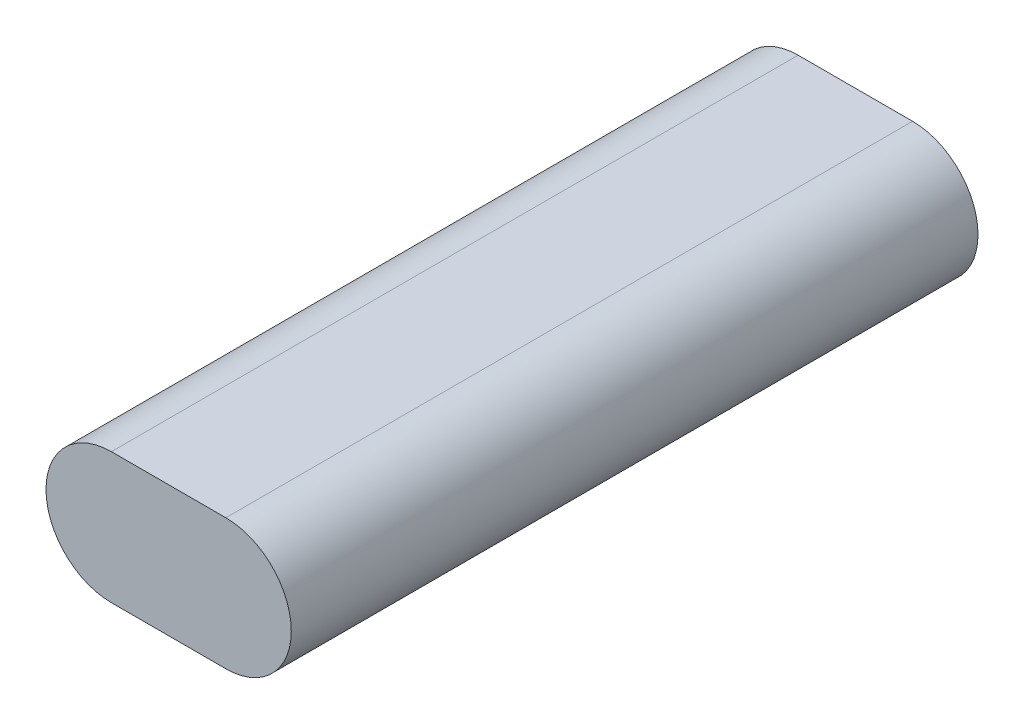
ISO-10303-21;
HEADER;
FILE_DESCRIPTION(('STEP AP214'),'2;1');
FILE_NAME('part.step','',(''),(''),'','','');
FILE_SCHEMA(('AUTOMOTIVE_DESIGN { 1 0 10303 214 1 1 1 1 }'));
ENDSEC;
DATA;
#1=APPLICATION_CONTEXT('core data for automotive mechanical design processes');
#2=APPLICATION_PROTOCOL_DEFINITION('international standard','automotive_design',2000,#1);
#3=PRODUCT_CONTEXT('',#1,'mechanical');
#4=PRODUCT('Part','Part','',(#3));
#5=PRODUCT_RELATED_PRODUCT_CATEGORY('part','',(#4));
#6=PRODUCT_DEFINITION_FORMATION('','',#4);
#7=PRODUCT_DEFINITION_CONTEXT('part definition',#1,'design');
#8=PRODUCT_DEFINITION('design','',#6,#7);
#9=PRODUCT_DEFINITION_SHAPE('','',#8);
#10=(LENGTH_UNIT() NAMED_UNIT(*) SI_UNIT(.MILLI.,.METRE.));
#11=(NAMED_UNIT(*) PLANE_ANGLE_UNIT() SI_UNIT($,.RADIAN.));
#12=(NAMED_UNIT(*) SI_UNIT($,.STERADIAN.) SOLID_ANGLE_UNIT());
#13=UNCERTAINTY_MEASURE_WITH_UNIT(LENGTH_MEASURE(1.E-05),#10,'distance_accuracy_value','');
#14=(GEOMETRIC_REPRESENTATION_CONTEXT(3) GLOBAL_UNCERTAINTY_ASSIGNED_CONTEXT((#13)) GLOBAL_UNIT_ASSIGNED_CONTEXT((#10,
#11,#12)) REPRESENTATION_CONTEXT('',''));
#15=CARTESIAN_POINT('',(0.,0.,0.));
#16=DIRECTION('',(0.,0.,1.));
#17=DIRECTION('',(1.,0.,0.));
#18=AXIS2_PLACEMENT_3D('',#15,#16,#17);
#19=CARTESIAN_POINT('',(-13.8687116564417,0.,133.35));
#20=DIRECTION('',(0.,0.,-1.));
#21=DIRECTION('',(-1.,0.,0.));
#22=AXIS2_PLACEMENT_3D('',#19,#20,#21);
#23=CYLINDRICAL_SURFACE('',#22,12.7);
#24=CARTESIAN_POINT('',(-13.8687116564417,0.,0.));
#25=DIRECTION('',(0.,0.,1.));
#26=DIRECTION('',(1.,0.,0.));
#27=AXIS2_PLACEMENT_3D('',#24,#25,#26);
#28=CIRCLE('',#27,12.7);
#29=CARTESIAN_POINT('',(-13.8687116564417,12.7,0.));
#30=VERTEX_POINT('',#29);
#31=CARTESIAN_POINT('',(-13.8687116564417,-12.7,0.));
#32=VERTEX_POINT('',#31);
#33=EDGE_CURVE('E96',#30,#32,#28,.T.);
#34=ORIENTED_EDGE('',*,*,#33,.T.);
#35=DIRECTION('',(0.,0.,-1.));
#36=VECTOR('',#35,1.);
#37=CARTESIAN_POINT('',(-13.8687116564417,-12.7,133.35));
#38=LINE('',#37,#36);
#39=CARTESIAN_POINT('',(-13.8687116564417,-12.7,133.35));
#40=VERTEX_POINT('',#39);
#41=EDGE_CURVE('E11',#40,#32,#38,.T.);
#42=ORIENTED_EDGE('',*,*,#41,.F.);
#43=CARTESIAN_POINT('',(-13.8687116564417,0.,133.35));
#44=DIRECTION('',(0.,0.,1.));
#45=DIRECTION('',(1.,0.,0.));
#46=AXIS2_PLACEMENT_3D('',#43,#44,#45);
#47=CIRCLE('',#46,12.7);
#48=CARTESIAN_POINT('',(-13.8687116564417,12.7,133.35));
#49=VERTEX_POINT('',#48);
#50=EDGE_CURVE('E84',#49,#40,#47,.T.);
#51=ORIENTED_EDGE('',*,*,#50,.F.);
#52=DIRECTION('',(0.,0.,-1.));
#53=VECTOR('',#52,1.);
#54=CARTESIAN_POINT('',(-13.8687116564417,12.7,133.35));
#55=LINE('',#54,#53);
#56=EDGE_CURVE('E92',#49,#30,#55,.T.);
#57=ORIENTED_EDGE('',*,*,#56,.T.);
#58=EDGE_LOOP('',(#34,#42,#51,#57));
#59=FACE_BOUND('',#58,.T.);
#60=ADVANCED_FACE('F33',(#59),#23,.T.);
#61=CARTESIAN_POINT('',(-13.8687116564417,-12.7,133.35));
#62=DIRECTION('',(0.,1.,0.));
#63=DIRECTION('',(0.,0.,1.));
#64=AXIS2_PLACEMENT_3D('',#61,#62,#63);
#65=PLANE('',#64);
#66=DIRECTION('',(1.,0.,0.));
#67=VECTOR('',#66,1.);
#68=CARTESIAN_POINT('',(-13.8687116564417,-12.7,0.));
#69=LINE('',#68,#67);
#70=CARTESIAN_POINT('',(8.35628834355827,-12.7,0.));
#71=VERTEX_POINT('',#70);
#72=EDGE_CURVE('E88',#32,#71,#69,.T.);
#73=ORIENTED_EDGE('',*,*,#72,.T.);
#74=DIRECTION('',(0.,0.,-1.));
#75=VECTOR('',#74,1.);
#76=CARTESIAN_POINT('',(8.35628834355827,-12.7,133.35));
#77=LINE('',#76,#75);
#78=CARTESIAN_POINT('',(8.35628834355827,-12.7,133.35));
#79=VERTEX_POINT('',#78);
#80=EDGE_CURVE('E41',#79,#71,#77,.T.);
#81=ORIENTED_EDGE('',*,*,#80,.F.);
#82=DIRECTION('',(1.,0.,0.));
#83=VECTOR('',#82,1.);
#84=CARTESIAN_POINT('',(-13.8687116564417,-12.7,133.35));
#85=LINE('',#84,#83);
#86=EDGE_CURVE('E79',#40,#79,#85,.T.);
#87=ORIENTED_EDGE('',*,*,#86,.F.);
#88=ORIENTED_EDGE('',*,*,#41,.T.);
#89=EDGE_LOOP('',(#73,#81,#87,#88));
#90=FACE_BOUND('',#89,.T.);
#91=ADVANCED_FACE('F87',(#90),#65,.F.);
#92=CARTESIAN_POINT('',(8.35628834355827,0.,133.35));
#93=DIRECTION('',(0.,0.,-1.));
#94=DIRECTION('',(-1.,0.,0.));
#95=AXIS2_PLACEMENT_3D('',#92,#93,#94);
#96=CYLINDRICAL_SURFACE('',#95,12.7);
#97=CARTESIAN_POINT('',(8.35628834355827,0.,0.));
#98=DIRECTION('',(0.,0.,1.));
#99=DIRECTION('',(1.,0.,0.));
#100=AXIS2_PLACEMENT_3D('',#97,#98,#99);
#101=CIRCLE('',#100,12.7);
#102=CARTESIAN_POINT('',(8.35628834355827,12.7,0.));
#103=VERTEX_POINT('',#102);
#104=EDGE_CURVE('E66',#71,#103,#101,.T.);
#105=ORIENTED_EDGE('',*,*,#104,.T.);
#106=DIRECTION('',(0.,0.,-1.));
#107=VECTOR('',#106,1.);
#108=CARTESIAN_POINT('',(8.35628834355827,12.7,133.35));
#109=LINE('',#108,#107);
#110=CARTESIAN_POINT('',(8.35628834355827,12.7,133.35));
#111=VERTEX_POINT('',#110);
#112=EDGE_CURVE('E89',#111,#103,#109,.T.);
#113=ORIENTED_EDGE('',*,*,#112,.F.);
#114=CARTESIAN_POINT('',(8.35628834355827,0.,133.35));
#115=DIRECTION('',(0.,0.,1.));
#116=DIRECTION('',(1.,0.,0.));
#117=AXIS2_PLACEMENT_3D('',#114,#115,#116);
#118=CIRCLE('',#117,12.7);
#119=EDGE_CURVE('E82',#79,#111,#118,.T.);
#120=ORIENTED_EDGE('',*,*,#119,.F.);
#121=ORIENTED_EDGE('',*,*,#80,.T.);
#122=EDGE_LOOP('',(#105,#113,#120,#121));
#123=FACE_BOUND('',#122,.T.);
#124=ADVANCED_FACE('F90',(#123),#96,.T.);
#125=CARTESIAN_POINT('',(-13.8687116564417,12.7,133.35));
#126=DIRECTION('',(0.,-1.,0.));
#127=DIRECTION('',(0.,0.,-1.));
#128=AXIS2_PLACEMENT_3D('',#125,#126,#127);
#129=PLANE('',#128);
#130=DIRECTION('',(-1.,0.,0.));
#131=VECTOR('',#130,1.);
#132=CARTESIAN_POINT('',(-13.8687116564417,12.7,0.));
#133=LINE('',#132,#131);
#134=EDGE_CURVE('E72',#103,#30,#133,.T.);
#135=ORIENTED_EDGE('',*,*,#134,.T.);
#136=ORIENTED_EDGE('',*,*,#56,.F.);
#137=DIRECTION('',(-1.,0.,0.));
#138=VECTOR('',#137,1.);
#139=CARTESIAN_POINT('',(-13.8687116564417,12.7,133.35));
#140=LINE('',#139,#138);
#141=EDGE_CURVE('E49',#111,#49,#140,.T.);
#142=ORIENTED_EDGE('',*,*,#141,.F.);
#143=ORIENTED_EDGE('',*,*,#112,.T.);
#144=EDGE_LOOP('',(#135,#136,#142,#143));
#145=FACE_BOUND('',#144,.T.);
#146=ADVANCED_FACE('F103',(#145),#129,.F.);
#147=CARTESIAN_POINT('',(-13.8687116564417,0.,133.35));
#148=DIRECTION('',(0.,0.,1.));
#149=DIRECTION('',(1.,0.,0.));
#150=AXIS2_PLACEMENT_3D('',#147,#148,#149);
#151=PLANE('',#150);
#152=ORIENTED_EDGE('',*,*,#50,.T.);
#153=ORIENTED_EDGE('',*,*,#86,.T.);
#154=ORIENTED_EDGE('',*,*,#119,.T.);
#155=ORIENTED_EDGE('',*,*,#141,.T.);
#156=EDGE_LOOP('',(#152,#153,#154,#155));
#157=FACE_BOUND('',#156,.T.);
#158=ADVANCED_FACE('F80',(#157),#151,.T.);
#159=CARTESIAN_POINT('',(-13.8687116564417,0.,0.));
#160=DIRECTION('',(0.,0.,1.));
#161=DIRECTION('',(1.,0.,0.));
#162=AXIS2_PLACEMENT_3D('',#159,#160,#161);
#163=PLANE('',#162);
#164=ORIENTED_EDGE('',*,*,#33,.F.);
#165=ORIENTED_EDGE('',*,*,#134,.F.);
#166=ORIENTED_EDGE('',*,*,#104,.F.);
#167=ORIENTED_EDGE('',*,*,#72,.F.);
#168=EDGE_LOOP('',(#164,#165,#166,#167));
#169=FACE_BOUND('',#168,.T.);
#170=ADVANCED_FACE('F106',(#169),#163,.F.);
#171=CLOSED_SHELL('',(#60,#91,#124,#146,#158,#170));
#172=MANIFOLD_SOLID_BREP('B2',#171);
#173=ADVANCED_BREP_SHAPE_REPRESENTATION('',(#18,#172),#14);
#174=SHAPE_DEFINITION_REPRESENTATION(#9,#173);
ENDSEC;
END-ISO-10303-21;
